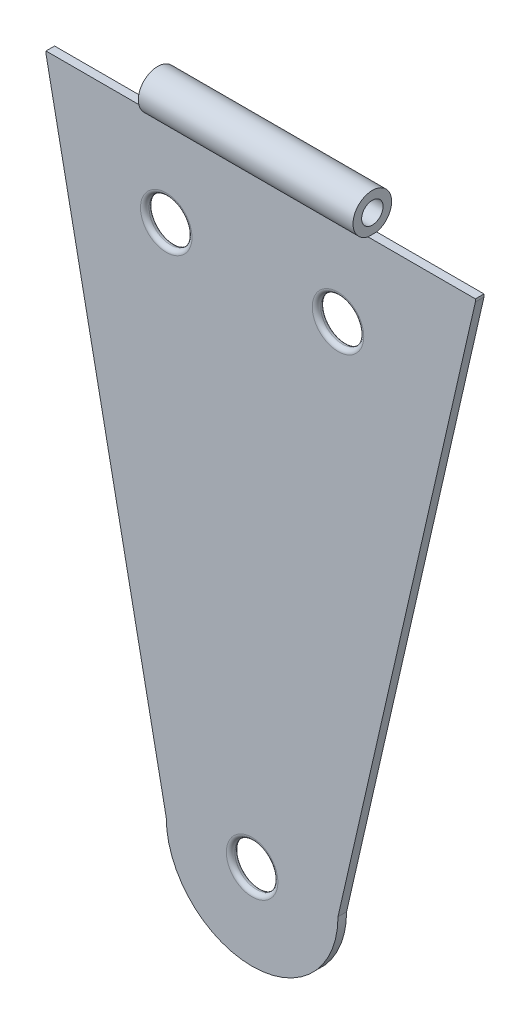
ISO-10303-21;
HEADER;
FILE_DESCRIPTION(('STEP AP214'),'2;1');
FILE_NAME('part.step','',(''),(''),'','','');
FILE_SCHEMA(('AUTOMOTIVE_DESIGN { 1 0 10303 214 1 1 1 1 }'));
ENDSEC;
DATA;
#1=APPLICATION_CONTEXT('core data for automotive mechanical design processes');
#2=APPLICATION_PROTOCOL_DEFINITION('international standard','automotive_design',2000,#1);
#3=PRODUCT_CONTEXT('',#1,'mechanical');
#4=PRODUCT('Part','Part','',(#3));
#5=PRODUCT_RELATED_PRODUCT_CATEGORY('part','',(#4));
#6=PRODUCT_DEFINITION_FORMATION('','',#4);
#7=PRODUCT_DEFINITION_CONTEXT('part definition',#1,'design');
#8=PRODUCT_DEFINITION('design','',#6,#7);
#9=PRODUCT_DEFINITION_SHAPE('','',#8);
#10=(LENGTH_UNIT() NAMED_UNIT(*) SI_UNIT(.MILLI.,.METRE.));
#11=(NAMED_UNIT(*) PLANE_ANGLE_UNIT() SI_UNIT($,.RADIAN.));
#12=(NAMED_UNIT(*) SI_UNIT($,.STERADIAN.) SOLID_ANGLE_UNIT());
#13=UNCERTAINTY_MEASURE_WITH_UNIT(LENGTH_MEASURE(1.E-05),#10,'distance_accuracy_value','');
#14=(GEOMETRIC_REPRESENTATION_CONTEXT(3) GLOBAL_UNCERTAINTY_ASSIGNED_CONTEXT((#13)) GLOBAL_UNIT_ASSIGNED_CONTEXT((#10,
#11,#12)) REPRESENTATION_CONTEXT('',''));
#15=CARTESIAN_POINT('',(0.,0.,0.));
#16=DIRECTION('',(0.,0.,1.));
#17=DIRECTION('',(1.,0.,0.));
#18=AXIS2_PLACEMENT_3D('',#15,#16,#17);
#19=CARTESIAN_POINT('',(50.,5.,2.));
#20=DIRECTION('',(-1.,0.,0.));
#21=DIRECTION('',(0.,0.,1.));
#22=AXIS2_PLACEMENT_3D('',#19,#20,#21);
#23=PLANE('',#22);
#24=DIRECTION('',(0.,-1.,0.));
#25=VECTOR('',#24,1.);
#26=CARTESIAN_POINT('',(50.,5.,0.));
#27=LINE('',#26,#25);
#28=CARTESIAN_POINT('',(50.,0.612517806303938,0.));
#29=VERTEX_POINT('',#28);
#30=CARTESIAN_POINT('',(50.,0.,0.));
#31=VERTEX_POINT('',#30);
#32=EDGE_CURVE('E191',#29,#31,#27,.T.);
#33=ORIENTED_EDGE('',*,*,#32,.F.);
#34=DIRECTION('',(0.,0.,-1.));
#35=VECTOR('',#34,1.);
#36=CARTESIAN_POINT('',(50.,0.612517806303938,5.5));
#37=LINE('',#36,#35);
#38=CARTESIAN_POINT('',(50.,0.612517806303938,2.));
#39=VERTEX_POINT('',#38);
#40=EDGE_CURVE('E308',#39,#29,#37,.T.);
#41=ORIENTED_EDGE('',*,*,#40,.F.);
#42=DIRECTION('',(0.,-1.,0.));
#43=VECTOR('',#42,1.);
#44=CARTESIAN_POINT('',(50.,5.,2.));
#45=LINE('',#44,#43);
#46=CARTESIAN_POINT('',(50.,0.,2.));
#47=VERTEX_POINT('',#46);
#48=EDGE_CURVE('E171',#39,#47,#45,.T.);
#49=ORIENTED_EDGE('',*,*,#48,.T.);
#50=DIRECTION('',(0.,0.,-1.));
#51=VECTOR('',#50,1.);
#52=CARTESIAN_POINT('',(50.,0.,2.));
#53=LINE('',#52,#51);
#54=EDGE_CURVE('E211',#47,#31,#53,.T.);
#55=ORIENTED_EDGE('',*,*,#54,.T.);
#56=EDGE_LOOP('',(#33,#41,#49,#55));
#57=FACE_BOUND('',#56,.T.);
#58=ADVANCED_FACE('F80',(#57),#23,.F.);
#59=CARTESIAN_POINT('',(-50.,5.,0.));
#60=DIRECTION('',(1.,0.,0.));
#61=DIRECTION('',(0.,0.,-1.));
#62=AXIS2_PLACEMENT_3D('',#59,#60,#61);
#63=PLANE('',#62);
#64=DIRECTION('',(0.,-1.,0.));
#65=VECTOR('',#64,1.);
#66=CARTESIAN_POINT('',(-50.,5.,2.));
#67=LINE('',#66,#65);
#68=CARTESIAN_POINT('',(-50.,0.612517806303938,2.));
#69=VERTEX_POINT('',#68);
#70=CARTESIAN_POINT('',(-50.,0.,2.));
#71=VERTEX_POINT('',#70);
#72=EDGE_CURVE('E101',#69,#71,#67,.T.);
#73=ORIENTED_EDGE('',*,*,#72,.F.);
#74=DIRECTION('',(0.,0.,-1.));
#75=VECTOR('',#74,1.);
#76=CARTESIAN_POINT('',(-50.,0.612517806303938,5.5));
#77=LINE('',#76,#75);
#78=CARTESIAN_POINT('',(-50.,0.612517806303938,0.));
#79=VERTEX_POINT('',#78);
#80=EDGE_CURVE('E170',#69,#79,#77,.T.);
#81=ORIENTED_EDGE('',*,*,#80,.T.);
#82=DIRECTION('',(0.,-1.,0.));
#83=VECTOR('',#82,1.);
#84=CARTESIAN_POINT('',(-50.,5.,0.));
#85=LINE('',#84,#83);
#86=CARTESIAN_POINT('',(-50.,0.,0.));
#87=VERTEX_POINT('',#86);
#88=EDGE_CURVE('E121',#79,#87,#85,.T.);
#89=ORIENTED_EDGE('',*,*,#88,.T.);
#90=DIRECTION('',(0.,0.,-1.));
#91=VECTOR('',#90,1.);
#92=CARTESIAN_POINT('',(-50.,0.,2.));
#93=LINE('',#92,#91);
#94=EDGE_CURVE('E201',#71,#87,#93,.T.);
#95=ORIENTED_EDGE('',*,*,#94,.F.);
#96=EDGE_LOOP('',(#73,#81,#89,#95));
#97=FACE_BOUND('',#96,.T.);
#98=ADVANCED_FACE('F259',(#97),#63,.F.);
#99=CARTESIAN_POINT('',(-2.00000000000006,-140.,2.));
#100=DIRECTION('',(0.,0.,1.));
#101=DIRECTION('',(1.,0.,0.));
#102=AXIS2_PLACEMENT_3D('',#99,#100,#101);
#103=PLANE('',#102);
#104=DIRECTION('',(1.,0.,0.));
#105=VECTOR('',#104,1.);
#106=CARTESIAN_POINT('',(-50.,0.612517806303938,2.));
#107=LINE('',#106,#105);
#108=CARTESIAN_POINT('',(-25.,0.612517806303938,2.));
#109=VERTEX_POINT('',#108);
#110=EDGE_CURVE('E167',#69,#109,#107,.T.);
#111=ORIENTED_EDGE('',*,*,#110,.F.);
#112=ORIENTED_EDGE('',*,*,#72,.T.);
#113=DIRECTION('',(0.196116135138184,-0.98058067569092,0.));
#114=VECTOR('',#113,1.);
#115=CARTESIAN_POINT('',(-50.,0.,2.));
#116=LINE('',#115,#114);
#117=CARTESIAN_POINT('',(-22.0000000000001,-140.,2.));
#118=VERTEX_POINT('',#117);
#119=EDGE_CURVE('E194',#71,#118,#116,.T.);
#120=ORIENTED_EDGE('',*,*,#119,.T.);
#121=CARTESIAN_POINT('',(-2.00000000000006,-140.,2.));
#122=DIRECTION('',(0.,0.,1.));
#123=DIRECTION('',(1.,0.,0.));
#124=AXIS2_PLACEMENT_3D('',#121,#122,#123);
#125=CIRCLE('',#124,20.);
#126=CARTESIAN_POINT('',(17.9999999999999,-140.,2.));
#127=VERTEX_POINT('',#126);
#128=EDGE_CURVE('E129',#118,#127,#125,.T.);
#129=ORIENTED_EDGE('',*,*,#128,.T.);
#130=DIRECTION('',(0.222824801502141,0.974858506571867,0.));
#131=VECTOR('',#130,1.);
#132=CARTESIAN_POINT('',(17.9999999999999,-140.,2.));
#133=LINE('',#132,#131);
#134=EDGE_CURVE('E198',#127,#47,#133,.T.);
#135=ORIENTED_EDGE('',*,*,#134,.T.);
#136=ORIENTED_EDGE('',*,*,#48,.F.);
#137=CARTESIAN_POINT('',(25.,0.612517806303938,2.));
#138=VERTEX_POINT('',#137);
#139=EDGE_CURVE('E173',#138,#39,#107,.T.);
#140=ORIENTED_EDGE('',*,*,#139,.F.);
#141=EDGE_CURVE('E158',#109,#138,#107,.T.);
#142=ORIENTED_EDGE('',*,*,#141,.F.);
#143=EDGE_LOOP('',(#111,#112,#120,#129,#135,#136,#140,#142));
#144=FACE_BOUND('',#143,.T.);
#145=CARTESIAN_POINT('',(-2.00000000000006,-140.,2.));
#146=DIRECTION('',(0.,0.,1.));
#147=DIRECTION('',(1.,0.,0.));
#148=AXIS2_PLACEMENT_3D('',#145,#146,#147);
#149=CIRCLE('',#148,6.00000000000001);
#150=CARTESIAN_POINT('',(3.99999999999995,-140.,2.));
#151=VERTEX_POINT('',#150);
#152=EDGE_CURVE('E225',#151,#151,#149,.F.);
#153=ORIENTED_EDGE('',*,*,#152,.T.);
#154=EDGE_LOOP('',(#153));
#155=FACE_BOUND('',#154,.T.);
#156=CARTESIAN_POINT('',(18.,-20.,2.));
#157=DIRECTION('',(0.,0.,1.));
#158=DIRECTION('',(1.,0.,0.));
#159=AXIS2_PLACEMENT_3D('',#156,#157,#158);
#160=CIRCLE('',#159,6.);
#161=CARTESIAN_POINT('',(24.,-20.,2.));
#162=VERTEX_POINT('',#161);
#163=EDGE_CURVE('E222',#162,#162,#160,.F.);
#164=ORIENTED_EDGE('',*,*,#163,.T.);
#165=EDGE_LOOP('',(#164));
#166=FACE_BOUND('',#165,.T.);
#167=CARTESIAN_POINT('',(-22.,-20.,2.));
#168=DIRECTION('',(0.,0.,1.));
#169=DIRECTION('',(1.,0.,0.));
#170=AXIS2_PLACEMENT_3D('',#167,#168,#169);
#171=CIRCLE('',#170,6.);
#172=CARTESIAN_POINT('',(-16.,-20.,2.));
#173=VERTEX_POINT('',#172);
#174=EDGE_CURVE('E219',#173,#173,#171,.F.);
#175=ORIENTED_EDGE('',*,*,#174,.T.);
#176=EDGE_LOOP('',(#175));
#177=FACE_BOUND('',#176,.T.);
#178=ADVANCED_FACE('F178',(#144,#155,#166,#177),#103,.T.);
#179=CARTESIAN_POINT('',(-2.00000000000006,-140.,0.));
#180=DIRECTION('',(0.,0.,1.));
#181=DIRECTION('',(1.,0.,0.));
#182=AXIS2_PLACEMENT_3D('',#179,#180,#181);
#183=PLANE('',#182);
#184=CARTESIAN_POINT('',(-2.00000000000006,-140.,0.));
#185=DIRECTION('',(0.,0.,1.));
#186=DIRECTION('',(1.,0.,0.));
#187=AXIS2_PLACEMENT_3D('',#184,#185,#186);
#188=CIRCLE('',#187,6.00000000000001);
#189=CARTESIAN_POINT('',(3.99999999999995,-140.,0.));
#190=VERTEX_POINT('',#189);
#191=EDGE_CURVE('E165',#190,#190,#188,.T.);
#192=ORIENTED_EDGE('',*,*,#191,.T.);
#193=EDGE_LOOP('',(#192));
#194=FACE_BOUND('',#193,.T.);
#195=CARTESIAN_POINT('',(18.,-20.,0.));
#196=DIRECTION('',(0.,0.,1.));
#197=DIRECTION('',(1.,0.,0.));
#198=AXIS2_PLACEMENT_3D('',#195,#196,#197);
#199=CIRCLE('',#198,6.);
#200=CARTESIAN_POINT('',(24.,-20.,0.));
#201=VERTEX_POINT('',#200);
#202=EDGE_CURVE('E231',#201,#201,#199,.T.);
#203=ORIENTED_EDGE('',*,*,#202,.T.);
#204=EDGE_LOOP('',(#203));
#205=FACE_BOUND('',#204,.T.);
#206=CARTESIAN_POINT('',(-22.,-20.,0.));
#207=DIRECTION('',(0.,0.,1.));
#208=DIRECTION('',(1.,0.,0.));
#209=AXIS2_PLACEMENT_3D('',#206,#207,#208);
#210=CIRCLE('',#209,6.);
#211=CARTESIAN_POINT('',(-16.,-20.,0.));
#212=VERTEX_POINT('',#211);
#213=EDGE_CURVE('E228',#212,#212,#210,.T.);
#214=ORIENTED_EDGE('',*,*,#213,.T.);
#215=EDGE_LOOP('',(#214));
#216=FACE_BOUND('',#215,.T.);
#217=ORIENTED_EDGE('',*,*,#88,.F.);
#218=DIRECTION('',(1.,0.,0.));
#219=VECTOR('',#218,1.);
#220=CARTESIAN_POINT('',(-50.,0.612517806303938,0.));
#221=LINE('',#220,#219);
#222=CARTESIAN_POINT('',(-25.,0.612517806303938,0.));
#223=VERTEX_POINT('',#222);
#224=EDGE_CURVE('E181',#79,#223,#221,.T.);
#225=ORIENTED_EDGE('',*,*,#224,.T.);
#226=CARTESIAN_POINT('',(25.,0.612517806303938,0.));
#227=VERTEX_POINT('',#226);
#228=EDGE_CURVE('E160',#223,#227,#221,.T.);
#229=ORIENTED_EDGE('',*,*,#228,.T.);
#230=EDGE_CURVE('E187',#227,#29,#221,.T.);
#231=ORIENTED_EDGE('',*,*,#230,.T.);
#232=ORIENTED_EDGE('',*,*,#32,.T.);
#233=DIRECTION('',(0.222824801502141,0.974858506571867,0.));
#234=VECTOR('',#233,1.);
#235=CARTESIAN_POINT('',(17.9999999999999,-140.,0.));
#236=LINE('',#235,#234);
#237=CARTESIAN_POINT('',(17.9999999999999,-140.,0.));
#238=VERTEX_POINT('',#237);
#239=EDGE_CURVE('E196',#238,#31,#236,.T.);
#240=ORIENTED_EDGE('',*,*,#239,.F.);
#241=CARTESIAN_POINT('',(-2.00000000000006,-140.,0.));
#242=DIRECTION('',(0.,0.,1.));
#243=DIRECTION('',(1.,0.,0.));
#244=AXIS2_PLACEMENT_3D('',#241,#242,#243);
#245=CIRCLE('',#244,20.);
#246=CARTESIAN_POINT('',(-22.0000000000001,-140.,0.));
#247=VERTEX_POINT('',#246);
#248=EDGE_CURVE('E205',#247,#238,#245,.T.);
#249=ORIENTED_EDGE('',*,*,#248,.F.);
#250=DIRECTION('',(0.196116135138184,-0.98058067569092,0.));
#251=VECTOR('',#250,1.);
#252=CARTESIAN_POINT('',(-50.,0.,0.));
#253=LINE('',#252,#251);
#254=EDGE_CURVE('E202',#87,#247,#253,.T.);
#255=ORIENTED_EDGE('',*,*,#254,.F.);
#256=EDGE_LOOP('',(#217,#225,#229,#231,#232,#240,#249,#255));
#257=FACE_BOUND('',#256,.T.);
#258=ADVANCED_FACE('F271',(#194,#205,#216,#257),#183,.F.);
#259=CARTESIAN_POINT('',(-50.,0.,2.));
#260=DIRECTION('',(0.98058067569092,0.196116135138184,0.));
#261=DIRECTION('',(-0.196116135138184,0.98058067569092,0.));
#262=AXIS2_PLACEMENT_3D('',#259,#260,#261);
#263=PLANE('',#262);
#264=ORIENTED_EDGE('',*,*,#254,.T.);
#265=DIRECTION('',(0.,0.,-1.));
#266=VECTOR('',#265,1.);
#267=CARTESIAN_POINT('',(-22.0000000000001,-140.,2.));
#268=LINE('',#267,#266);
#269=EDGE_CURVE('E217',#118,#247,#268,.T.);
#270=ORIENTED_EDGE('',*,*,#269,.F.);
#271=ORIENTED_EDGE('',*,*,#119,.F.);
#272=ORIENTED_EDGE('',*,*,#94,.T.);
#273=EDGE_LOOP('',(#264,#270,#271,#272));
#274=FACE_BOUND('',#273,.T.);
#275=ADVANCED_FACE('F274',(#274),#263,.F.);
#276=CARTESIAN_POINT('',(-2.00000000000006,-140.,2.));
#277=DIRECTION('',(0.,0.,-1.));
#278=DIRECTION('',(-1.,0.,0.));
#279=AXIS2_PLACEMENT_3D('',#276,#277,#278);
#280=CYLINDRICAL_SURFACE('',#279,20.);
#281=ORIENTED_EDGE('',*,*,#248,.T.);
#282=DIRECTION('',(0.,0.,-1.));
#283=VECTOR('',#282,1.);
#284=CARTESIAN_POINT('',(17.9999999999999,-140.,2.));
#285=LINE('',#284,#283);
#286=EDGE_CURVE('E214',#127,#238,#285,.T.);
#287=ORIENTED_EDGE('',*,*,#286,.F.);
#288=ORIENTED_EDGE('',*,*,#128,.F.);
#289=ORIENTED_EDGE('',*,*,#269,.T.);
#290=EDGE_LOOP('',(#281,#287,#288,#289));
#291=FACE_BOUND('',#290,.T.);
#292=ADVANCED_FACE('F280',(#291),#280,.T.);
#293=CARTESIAN_POINT('',(17.9999999999999,-140.,2.));
#294=DIRECTION('',(-0.974858506571867,0.222824801502141,0.));
#295=DIRECTION('',(-0.222824801502141,-0.974858506571867,0.));
#296=AXIS2_PLACEMENT_3D('',#293,#294,#295);
#297=PLANE('',#296);
#298=ORIENTED_EDGE('',*,*,#239,.T.);
#299=ORIENTED_EDGE('',*,*,#54,.F.);
#300=ORIENTED_EDGE('',*,*,#134,.F.);
#301=ORIENTED_EDGE('',*,*,#286,.T.);
#302=EDGE_LOOP('',(#298,#299,#300,#301));
#303=FACE_BOUND('',#302,.T.);
#304=ADVANCED_FACE('F276',(#303),#297,.F.);
#305=CARTESIAN_POINT('',(-2.00000000000006,-140.,1.));
#306=DIRECTION('',(0.,0.,1.));
#307=DIRECTION('',(1.,0.,0.));
#308=AXIS2_PLACEMENT_3D('',#305,#306,#307);
#309=TOROIDAL_SURFACE('',#308,6.00000000000001,1.);
#310=ORIENTED_EDGE('',*,*,#191,.F.);
#311=EDGE_LOOP('',(#310));
#312=FACE_BOUND('',#311,.T.);
#313=CARTESIAN_POINT('',(-2.00000000000006,-140.,1.));
#314=DIRECTION('',(0.,0.,1.));
#315=DIRECTION('',(1.,0.,0.));
#316=AXIS2_PLACEMENT_3D('',#313,#314,#315);
#317=CIRCLE('',#316,5.00000000000001);
#318=CARTESIAN_POINT('',(2.99999999999995,-140.,1.));
#319=VERTEX_POINT('',#318);
#320=EDGE_CURVE('E206',#319,#319,#317,.F.);
#321=ORIENTED_EDGE('',*,*,#320,.F.);
#322=EDGE_LOOP('',(#321));
#323=FACE_BOUND('',#322,.T.);
#324=ADVANCED_FACE('F279',(#312,#323),#309,.T.);
#325=CARTESIAN_POINT('',(-2.00000000000006,-140.,1.));
#326=DIRECTION('',(0.,0.,1.));
#327=DIRECTION('',(1.,0.,0.));
#328=AXIS2_PLACEMENT_3D('',#325,#326,#327);
#329=TOROIDAL_SURFACE('',#328,6.00000000000001,1.);
#330=ORIENTED_EDGE('',*,*,#152,.F.);
#331=EDGE_LOOP('',(#330));
#332=FACE_BOUND('',#331,.T.);
#333=ORIENTED_EDGE('',*,*,#320,.T.);
#334=EDGE_LOOP('',(#333));
#335=FACE_BOUND('',#334,.T.);
#336=ADVANCED_FACE('F287',(#332,#335),#329,.T.);
#337=CARTESIAN_POINT('',(18.,-20.,1.));
#338=DIRECTION('',(0.,0.,1.));
#339=DIRECTION('',(1.,0.,0.));
#340=AXIS2_PLACEMENT_3D('',#337,#338,#339);
#341=TOROIDAL_SURFACE('',#340,6.,1.);
#342=ORIENTED_EDGE('',*,*,#202,.F.);
#343=EDGE_LOOP('',(#342));
#344=FACE_BOUND('',#343,.T.);
#345=CARTESIAN_POINT('',(18.,-20.,1.));
#346=DIRECTION('',(0.,0.,1.));
#347=DIRECTION('',(1.,0.,0.));
#348=AXIS2_PLACEMENT_3D('',#345,#346,#347);
#349=CIRCLE('',#348,5.);
#350=CARTESIAN_POINT('',(23.,-20.,1.));
#351=VERTEX_POINT('',#350);
#352=EDGE_CURVE('E238',#351,#351,#349,.F.);
#353=ORIENTED_EDGE('',*,*,#352,.F.);
#354=EDGE_LOOP('',(#353));
#355=FACE_BOUND('',#354,.T.);
#356=ADVANCED_FACE('F254',(#344,#355),#341,.T.);
#357=CARTESIAN_POINT('',(18.,-20.,1.));
#358=DIRECTION('',(0.,0.,1.));
#359=DIRECTION('',(1.,0.,0.));
#360=AXIS2_PLACEMENT_3D('',#357,#358,#359);
#361=TOROIDAL_SURFACE('',#360,6.,1.);
#362=ORIENTED_EDGE('',*,*,#163,.F.);
#363=EDGE_LOOP('',(#362));
#364=FACE_BOUND('',#363,.T.);
#365=ORIENTED_EDGE('',*,*,#352,.T.);
#366=EDGE_LOOP('',(#365));
#367=FACE_BOUND('',#366,.T.);
#368=ADVANCED_FACE('F247',(#364,#367),#361,.T.);
#369=CARTESIAN_POINT('',(-22.,-20.,1.));
#370=DIRECTION('',(0.,0.,1.));
#371=DIRECTION('',(1.,0.,0.));
#372=AXIS2_PLACEMENT_3D('',#369,#370,#371);
#373=TOROIDAL_SURFACE('',#372,6.,1.);
#374=ORIENTED_EDGE('',*,*,#213,.F.);
#375=EDGE_LOOP('',(#374));
#376=FACE_BOUND('',#375,.T.);
#377=CARTESIAN_POINT('',(-22.,-20.,1.));
#378=DIRECTION('',(0.,0.,1.));
#379=DIRECTION('',(1.,0.,0.));
#380=AXIS2_PLACEMENT_3D('',#377,#378,#379);
#381=CIRCLE('',#380,5.);
#382=CARTESIAN_POINT('',(-17.,-20.,1.));
#383=VERTEX_POINT('',#382);
#384=EDGE_CURVE('E193',#383,#383,#381,.F.);
#385=ORIENTED_EDGE('',*,*,#384,.F.);
#386=EDGE_LOOP('',(#385));
#387=FACE_BOUND('',#386,.T.);
#388=ADVANCED_FACE('F82',(#376,#387),#373,.T.);
#389=CARTESIAN_POINT('',(-22.,-20.,1.));
#390=DIRECTION('',(0.,0.,1.));
#391=DIRECTION('',(1.,0.,0.));
#392=AXIS2_PLACEMENT_3D('',#389,#390,#391);
#393=TOROIDAL_SURFACE('',#392,6.,1.);
#394=ORIENTED_EDGE('',*,*,#174,.F.);
#395=EDGE_LOOP('',(#394));
#396=FACE_BOUND('',#395,.T.);
#397=ORIENTED_EDGE('',*,*,#384,.T.);
#398=EDGE_LOOP('',(#397));
#399=FACE_BOUND('',#398,.T.);
#400=ADVANCED_FACE('F244',(#396,#399),#393,.T.);
#401=CARTESIAN_POINT('',(-50.,5.,1.));
#402=DIRECTION('',(1.,0.,0.));
#403=DIRECTION('',(0.,0.,-1.));
#404=AXIS2_PLACEMENT_3D('',#401,#402,#403);
#405=CYLINDRICAL_SURFACE('',#404,4.5);
#406=CARTESIAN_POINT('',(25.,5.,1.));
#407=DIRECTION('',(-1.,0.,0.));
#408=DIRECTION('',(0.,0.,1.));
#409=AXIS2_PLACEMENT_3D('',#406,#407,#408);
#410=CIRCLE('',#409,4.5);
#411=EDGE_CURVE('E12',#227,#138,#410,.F.);
#412=ORIENTED_EDGE('',*,*,#411,.F.);
#413=ORIENTED_EDGE('',*,*,#228,.F.);
#414=CARTESIAN_POINT('',(-25.,5.,1.));
#415=DIRECTION('',(1.,0.,0.));
#416=DIRECTION('',(0.,0.,-1.));
#417=AXIS2_PLACEMENT_3D('',#414,#415,#416);
#418=CIRCLE('',#417,4.5);
#419=EDGE_CURVE('E88',#109,#223,#418,.F.);
#420=ORIENTED_EDGE('',*,*,#419,.F.);
#421=ORIENTED_EDGE('',*,*,#141,.T.);
#422=EDGE_LOOP('',(#412,#413,#420,#421));
#423=FACE_BOUND('',#422,.T.);
#424=ADVANCED_FACE('F156',(#423),#405,.T.);
#425=CARTESIAN_POINT('',(-25.,0.612517806303938,5.5));
#426=DIRECTION('',(1.,0.,0.));
#427=DIRECTION('',(0.,0.,-1.));
#428=AXIS2_PLACEMENT_3D('',#425,#426,#427);
#429=PLANE('',#428);
#430=ORIENTED_EDGE('',*,*,#419,.T.);
#431=DIRECTION('',(0.,0.,-1.));
#432=VECTOR('',#431,1.);
#433=CARTESIAN_POINT('',(-25.,0.612517806303938,5.5));
#434=LINE('',#433,#432);
#435=EDGE_CURVE('E169',#109,#223,#434,.T.);
#436=ORIENTED_EDGE('',*,*,#435,.F.);
#437=EDGE_LOOP('',(#430,#436));
#438=FACE_BOUND('',#437,.T.);
#439=CARTESIAN_POINT('',(-25.,5.,1.));
#440=DIRECTION('',(1.,0.,0.));
#441=DIRECTION('',(0.,0.,-1.));
#442=AXIS2_PLACEMENT_3D('',#439,#440,#441);
#443=CIRCLE('',#442,2.5);
#444=CARTESIAN_POINT('',(-25.,5.,-1.5));
#445=VERTEX_POINT('',#444);
#446=EDGE_CURVE('E313',#445,#445,#443,.F.);
#447=ORIENTED_EDGE('',*,*,#446,.F.);
#448=EDGE_LOOP('',(#447));
#449=FACE_BOUND('',#448,.T.);
#450=ADVANCED_FACE('F174',(#438,#449),#429,.F.);
#451=CARTESIAN_POINT('',(-50.,0.612517806303938,5.5));
#452=DIRECTION('',(0.,-1.,0.));
#453=DIRECTION('',(0.,0.,-1.));
#454=AXIS2_PLACEMENT_3D('',#451,#452,#453);
#455=PLANE('',#454);
#456=ORIENTED_EDGE('',*,*,#224,.F.);
#457=ORIENTED_EDGE('',*,*,#80,.F.);
#458=ORIENTED_EDGE('',*,*,#110,.T.);
#459=ORIENTED_EDGE('',*,*,#435,.T.);
#460=EDGE_LOOP('',(#456,#457,#458,#459));
#461=FACE_BOUND('',#460,.T.);
#462=ADVANCED_FACE('F168',(#461),#455,.F.);
#463=CARTESIAN_POINT('',(25.,0.612517806303938,5.5));
#464=DIRECTION('',(-1.,0.,0.));
#465=DIRECTION('',(0.,0.,1.));
#466=AXIS2_PLACEMENT_3D('',#463,#464,#465);
#467=PLANE('',#466);
#468=ORIENTED_EDGE('',*,*,#411,.T.);
#469=DIRECTION('',(0.,0.,-1.));
#470=VECTOR('',#469,1.);
#471=CARTESIAN_POINT('',(25.,0.612517806303938,5.5));
#472=LINE('',#471,#470);
#473=EDGE_CURVE('E310',#138,#227,#472,.T.);
#474=ORIENTED_EDGE('',*,*,#473,.T.);
#475=EDGE_LOOP('',(#468,#474));
#476=FACE_BOUND('',#475,.T.);
#477=CARTESIAN_POINT('',(25.,5.,1.));
#478=DIRECTION('',(-1.,0.,0.));
#479=DIRECTION('',(0.,0.,1.));
#480=AXIS2_PLACEMENT_3D('',#477,#478,#479);
#481=CIRCLE('',#480,2.5);
#482=CARTESIAN_POINT('',(25.,5.,3.5));
#483=VERTEX_POINT('',#482);
#484=EDGE_CURVE('E184',#483,#483,#481,.F.);
#485=ORIENTED_EDGE('',*,*,#484,.F.);
#486=EDGE_LOOP('',(#485));
#487=FACE_BOUND('',#486,.T.);
#488=ADVANCED_FACE('F318',(#476,#487),#467,.F.);
#489=CARTESIAN_POINT('',(50.,0.612517806303938,5.5));
#490=DIRECTION('',(0.,-1.,0.));
#491=DIRECTION('',(0.,0.,-1.));
#492=AXIS2_PLACEMENT_3D('',#489,#490,#491);
#493=PLANE('',#492);
#494=ORIENTED_EDGE('',*,*,#230,.F.);
#495=ORIENTED_EDGE('',*,*,#473,.F.);
#496=ORIENTED_EDGE('',*,*,#139,.T.);
#497=ORIENTED_EDGE('',*,*,#40,.T.);
#498=EDGE_LOOP('',(#494,#495,#496,#497));
#499=FACE_BOUND('',#498,.T.);
#500=ADVANCED_FACE('F326',(#499),#493,.F.);
#501=CARTESIAN_POINT('',(-50.,5.,1.));
#502=DIRECTION('',(1.,0.,0.));
#503=DIRECTION('',(0.,0.,-1.));
#504=AXIS2_PLACEMENT_3D('',#501,#502,#503);
#505=CYLINDRICAL_SURFACE('',#504,2.5);
#506=ORIENTED_EDGE('',*,*,#484,.T.);
#507=EDGE_LOOP('',(#506));
#508=FACE_BOUND('',#507,.T.);
#509=ORIENTED_EDGE('',*,*,#446,.T.);
#510=EDGE_LOOP('',(#509));
#511=FACE_BOUND('',#510,.T.);
#512=ADVANCED_FACE('F328',(#508,#511),#505,.F.);
#513=CLOSED_SHELL('',(#58,#98,#178,#258,#275,#292,#304,#324,#336,#356,#368,#388,#400,#424,#450,
#462,#488,#500,#512));
#514=MANIFOLD_SOLID_BREP('B2',#513);
#515=ADVANCED_BREP_SHAPE_REPRESENTATION('',(#18,#514),#14);
#516=SHAPE_DEFINITION_REPRESENTATION(#9,#515);
ENDSEC;
END-ISO-10303-21;
